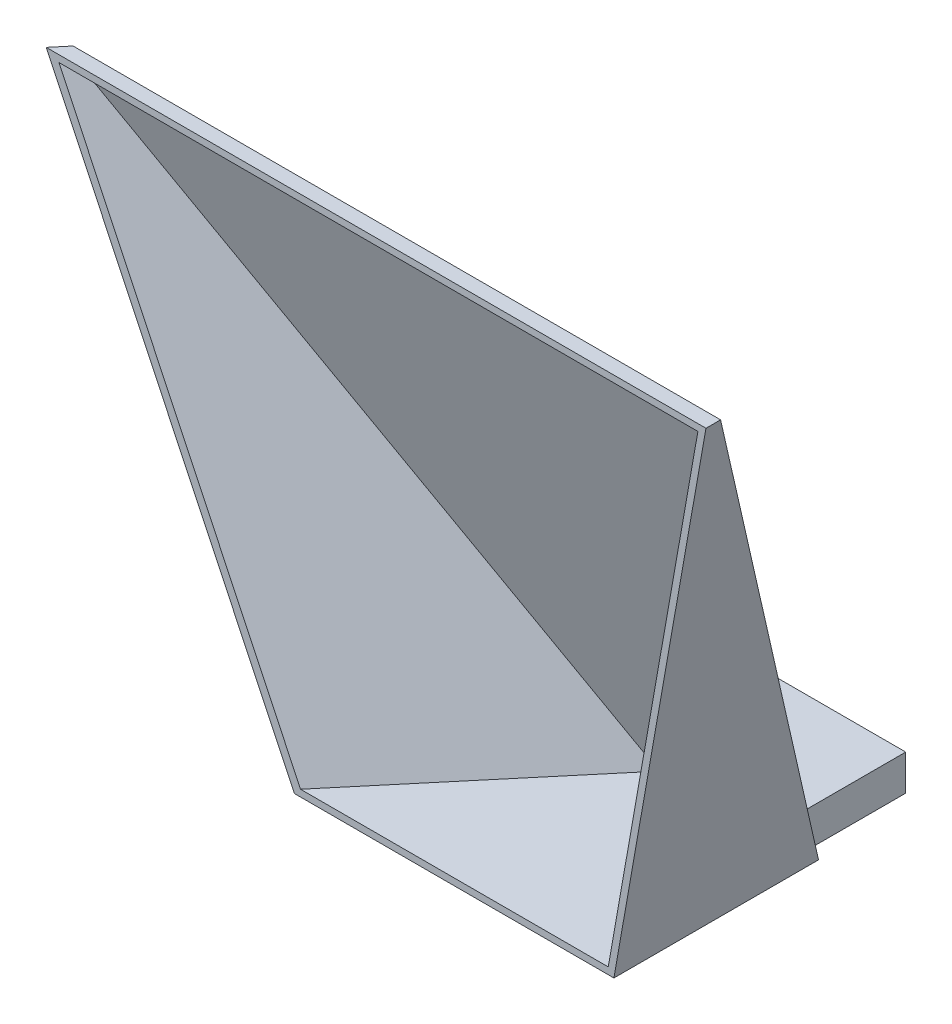
ISO-10303-21;
HEADER;
FILE_DESCRIPTION(('STEP AP214'),'2;1');
FILE_NAME('part.step','',(''),(''),'','','');
FILE_SCHEMA(('AUTOMOTIVE_DESIGN { 1 0 10303 214 1 1 1 1 }'));
ENDSEC;
DATA;
#1=APPLICATION_CONTEXT('core data for automotive mechanical design processes');
#2=APPLICATION_PROTOCOL_DEFINITION('international standard','automotive_design',2000,#1);
#3=PRODUCT_CONTEXT('',#1,'mechanical');
#4=PRODUCT('Part','Part','',(#3));
#5=PRODUCT_RELATED_PRODUCT_CATEGORY('part','',(#4));
#6=PRODUCT_DEFINITION_FORMATION('','',#4);
#7=PRODUCT_DEFINITION_CONTEXT('part definition',#1,'design');
#8=PRODUCT_DEFINITION('design','',#6,#7);
#9=PRODUCT_DEFINITION_SHAPE('','',#8);
#10=(LENGTH_UNIT() NAMED_UNIT(*) SI_UNIT(.MILLI.,.METRE.));
#11=(NAMED_UNIT(*) PLANE_ANGLE_UNIT() SI_UNIT($,.RADIAN.));
#12=(NAMED_UNIT(*) SI_UNIT($,.STERADIAN.) SOLID_ANGLE_UNIT());
#13=UNCERTAINTY_MEASURE_WITH_UNIT(LENGTH_MEASURE(1.E-05),#10,'distance_accuracy_value','');
#14=(GEOMETRIC_REPRESENTATION_CONTEXT(3) GLOBAL_UNCERTAINTY_ASSIGNED_CONTEXT((#13)) GLOBAL_UNIT_ASSIGNED_CONTEXT((#10,
#11,#12)) REPRESENTATION_CONTEXT('',''));
#15=CARTESIAN_POINT('',(0.,0.,0.));
#16=DIRECTION('',(0.,0.,1.));
#17=DIRECTION('',(1.,0.,0.));
#18=AXIS2_PLACEMENT_3D('',#15,#16,#17);
#19=CARTESIAN_POINT('',(-41.,3.49999999999999,219.382140559722));
#20=DIRECTION('',(-1.,0.,0.));
#21=DIRECTION('',(0.,1.,0.));
#22=AXIS2_PLACEMENT_3D('',#19,#20,#21);
#23=PLANE('',#22);
#24=DIRECTION('',(0.,-0.939692620785908,-0.34202014332567));
#25=VECTOR('',#24,1.);
#26=CARTESIAN_POINT('',(-41.,20.5000000000001,7.46138980245723));
#27=LINE('',#26,#25);
#28=CARTESIAN_POINT('',(-41.,20.5,7.46138980245722));
#29=VERTEX_POINT('',#28);
#30=CARTESIAN_POINT('',(-41.,3.50000000000004,1.27389581993178));
#31=VERTEX_POINT('',#30);
#32=EDGE_CURVE('E10',#29,#31,#27,.T.);
#33=ORIENTED_EDGE('',*,*,#32,.T.);
#34=DIRECTION('',(0.,0.,-1.));
#35=VECTOR('',#34,1.);
#36=CARTESIAN_POINT('',(-41.,3.49999999999999,1.27389581993177));
#37=LINE('',#36,#35);
#38=CARTESIAN_POINT('',(-41.,3.49999999999997,-60.));
#39=VERTEX_POINT('',#38);
#40=EDGE_CURVE('E255',#31,#39,#37,.T.);
#41=ORIENTED_EDGE('',*,*,#40,.T.);
#42=DIRECTION('',(0.,-1.,0.));
#43=VECTOR('',#42,1.);
#44=CARTESIAN_POINT('',(-41.,20.4999999999999,-60.));
#45=LINE('',#44,#43);
#46=CARTESIAN_POINT('',(-41.,20.4999999999999,-60.));
#47=VERTEX_POINT('',#46);
#48=EDGE_CURVE('E248',#47,#39,#45,.T.);
#49=ORIENTED_EDGE('',*,*,#48,.F.);
#50=DIRECTION('',(0.,0.,-1.));
#51=VECTOR('',#50,1.);
#52=CARTESIAN_POINT('',(-41.,20.5,7.46138980245721));
#53=LINE('',#52,#51);
#54=EDGE_CURVE('E251',#29,#47,#53,.T.);
#55=ORIENTED_EDGE('',*,*,#54,.F.);
#56=EDGE_LOOP('',(#33,#41,#49,#55));
#57=FACE_BOUND('',#56,.T.);
#58=ADVANCED_FACE('F16',(#57),#23,.F.);
#59=CARTESIAN_POINT('',(-41.,20.5,219.382140559722));
#60=DIRECTION('',(0.,1.,0.));
#61=DIRECTION('',(1.,0.,0.));
#62=AXIS2_PLACEMENT_3D('',#59,#60,#61);
#63=PLANE('',#62);
#64=DIRECTION('',(-1.,0.,0.));
#65=VECTOR('',#64,1.);
#66=CARTESIAN_POINT('',(41.,20.5,7.46138980245722));
#67=LINE('',#66,#65);
#68=CARTESIAN_POINT('',(41.,20.5,7.46138980245721));
#69=VERTEX_POINT('',#68);
#70=EDGE_CURVE('E23',#69,#29,#67,.T.);
#71=ORIENTED_EDGE('',*,*,#70,.T.);
#72=ORIENTED_EDGE('',*,*,#54,.T.);
#73=DIRECTION('',(-1.,0.,0.));
#74=VECTOR('',#73,1.);
#75=CARTESIAN_POINT('',(41.,20.5,-60.));
#76=LINE('',#75,#74);
#77=CARTESIAN_POINT('',(41.,20.5,-60.));
#78=VERTEX_POINT('',#77);
#79=EDGE_CURVE('E241',#78,#47,#76,.T.);
#80=ORIENTED_EDGE('',*,*,#79,.F.);
#81=DIRECTION('',(0.,0.,-1.));
#82=VECTOR('',#81,1.);
#83=CARTESIAN_POINT('',(41.,20.5,7.46138980245721));
#84=LINE('',#83,#82);
#85=EDGE_CURVE('E244',#69,#78,#84,.T.);
#86=ORIENTED_EDGE('',*,*,#85,.F.);
#87=EDGE_LOOP('',(#71,#72,#80,#86));
#88=FACE_BOUND('',#87,.T.);
#89=ADVANCED_FACE('F266',(#88),#63,.F.);
#90=CARTESIAN_POINT('',(41.,20.5,219.382140559722));
#91=DIRECTION('',(1.,0.,0.));
#92=DIRECTION('',(0.,-1.,0.));
#93=AXIS2_PLACEMENT_3D('',#90,#91,#92);
#94=PLANE('',#93);
#95=DIRECTION('',(0.,0.939692620785908,0.34202014332567));
#96=VECTOR('',#95,1.);
#97=CARTESIAN_POINT('',(41.,3.50000000000005,1.27389581993175));
#98=LINE('',#97,#96);
#99=CARTESIAN_POINT('',(41.,3.50000000000003,1.27389581993173));
#100=VERTEX_POINT('',#99);
#101=EDGE_CURVE('E253',#100,#69,#98,.T.);
#102=ORIENTED_EDGE('',*,*,#101,.T.);
#103=ORIENTED_EDGE('',*,*,#85,.T.);
#104=DIRECTION('',(0.,1.,0.));
#105=VECTOR('',#104,1.);
#106=CARTESIAN_POINT('',(41.,3.49999999999994,-60.));
#107=LINE('',#106,#105);
#108=CARTESIAN_POINT('',(41.,3.49999999999994,-60.));
#109=VERTEX_POINT('',#108);
#110=EDGE_CURVE('E233',#109,#78,#107,.T.);
#111=ORIENTED_EDGE('',*,*,#110,.F.);
#112=DIRECTION('',(0.,0.,-1.));
#113=VECTOR('',#112,1.);
#114=CARTESIAN_POINT('',(41.,3.50000000000001,1.27389581993171));
#115=LINE('',#114,#113);
#116=EDGE_CURVE('E236',#100,#109,#115,.T.);
#117=ORIENTED_EDGE('',*,*,#116,.F.);
#118=EDGE_LOOP('',(#102,#103,#111,#117));
#119=FACE_BOUND('',#118,.T.);
#120=ADVANCED_FACE('F271',(#119),#94,.F.);
#121=CARTESIAN_POINT('',(41.,3.50000000000001,219.382140559722));
#122=DIRECTION('',(0.,-1.,0.));
#123=DIRECTION('',(-1.,0.,0.));
#124=AXIS2_PLACEMENT_3D('',#121,#122,#123);
#125=PLANE('',#124);
#126=DIRECTION('',(1.,0.,0.));
#127=VECTOR('',#126,1.);
#128=CARTESIAN_POINT('',(-41.,3.50000000000005,1.27389581993176));
#129=LINE('',#128,#127);
#130=EDGE_CURVE('E246',#31,#100,#129,.T.);
#131=ORIENTED_EDGE('',*,*,#130,.T.);
#132=ORIENTED_EDGE('',*,*,#116,.T.);
#133=DIRECTION('',(1.,0.,0.));
#134=VECTOR('',#133,1.);
#135=CARTESIAN_POINT('',(-41.,3.49999999999999,-60.));
#136=LINE('',#135,#134);
#137=EDGE_CURVE('E222',#39,#109,#136,.T.);
#138=ORIENTED_EDGE('',*,*,#137,.F.);
#139=ORIENTED_EDGE('',*,*,#40,.F.);
#140=EDGE_LOOP('',(#131,#132,#138,#139));
#141=FACE_BOUND('',#140,.T.);
#142=ADVANCED_FACE('F260',(#141),#125,.F.);
#143=CARTESIAN_POINT('',(-138.996457585162,301.368080573303,105.432299796717));
#144=DIRECTION('',(0.,-0.34202014332567,0.939692620785908));
#145=DIRECTION('',(0.,-0.939692620785908,-0.34202014332567));
#146=AXIS2_PLACEMENT_3D('',#143,#144,#145);
#147=PLANE('',#146);
#148=DIRECTION('',(-1.,0.,0.));
#149=VECTOR('',#148,1.);
#150=CARTESIAN_POINT('',(100.165108582928,304.,106.390240127022));
#151=LINE('',#150,#149);
#152=CARTESIAN_POINT('',(100.165108582928,304.,106.390240127022));
#153=VERTEX_POINT('',#152);
#154=CARTESIAN_POINT('',(-281.768089597403,304.,106.390240127022));
#155=VERTEX_POINT('',#154);
#156=EDGE_CURVE('E238',#153,#155,#151,.T.);
#157=ORIENTED_EDGE('',*,*,#156,.F.);
#158=DIRECTION('',(0.163464460888888,0.927053025192544,0.337419706756523));
#159=VECTOR('',#158,1.);
#160=CARTESIAN_POINT('',(45.8563985247085,-4.,-5.71259202696845));
#161=LINE('',#160,#159);
#162=CARTESIAN_POINT('',(45.8563985247085,-4.,-5.71259202696845));
#163=VERTEX_POINT('',#162);
#164=EDGE_CURVE('E227',#163,#153,#161,.T.);
#165=ORIENTED_EDGE('',*,*,#164,.F.);
#166=DIRECTION('',(1.,0.,0.));
#167=VECTOR('',#166,1.);
#168=CARTESIAN_POINT('',(-41.3627902348096,-4.,-5.71259202696842));
#169=LINE('',#168,#167);
#170=CARTESIAN_POINT('',(-41.3627902348096,-4.,-5.71259202696842));
#171=VERTEX_POINT('',#170);
#172=EDGE_CURVE('E214',#171,#163,#169,.T.);
#173=ORIENTED_EDGE('',*,*,#172,.F.);
#174=DIRECTION('',(0.591432474210392,-0.75772540181011,-0.275789492006279));
#175=VECTOR('',#174,1.);
#176=CARTESIAN_POINT('',(-281.768089597403,304.,106.390240127022));
#177=LINE('',#176,#175);
#178=EDGE_CURVE('E203',#155,#171,#177,.T.);
#179=ORIENTED_EDGE('',*,*,#178,.F.);
#180=EDGE_LOOP('',(#157,#165,#173,#179));
#181=FACE_BOUND('',#180,.T.);
#182=DIRECTION('',(0.,-0.939692620785908,-0.34202014332567));
#183=VECTOR('',#182,1.);
#184=CARTESIAN_POINT('',(-43.,22.5000000000001,3.93261918108598));
#185=LINE('',#184,#183);
#186=CARTESIAN_POINT('',(-43.,22.5,3.93261918108599));
#187=VERTEX_POINT('',#186);
#188=CARTESIAN_POINT('',(-43.,1.50000000000002,-3.71075573850429));
#189=VERTEX_POINT('',#188);
#190=EDGE_CURVE('E225',#187,#189,#185,.T.);
#191=ORIENTED_EDGE('',*,*,#190,.T.);
#192=DIRECTION('',(1.,0.,0.));
#193=VECTOR('',#192,1.);
#194=CARTESIAN_POINT('',(-43.,1.50000000000011,-3.71075573850428));
#195=LINE('',#194,#193);
#196=CARTESIAN_POINT('',(43.,1.50000000000002,-3.71075573850432));
#197=VERTEX_POINT('',#196);
#198=EDGE_CURVE('E211',#189,#197,#195,.T.);
#199=ORIENTED_EDGE('',*,*,#198,.T.);
#200=DIRECTION('',(0.,0.939692620785908,0.34202014332567));
#201=VECTOR('',#200,1.);
#202=CARTESIAN_POINT('',(43.,1.50000000000005,-3.71075573850431));
#203=LINE('',#202,#201);
#204=CARTESIAN_POINT('',(43.,22.5,3.93261918108597));
#205=VERTEX_POINT('',#204);
#206=EDGE_CURVE('E219',#197,#205,#203,.T.);
#207=ORIENTED_EDGE('',*,*,#206,.T.);
#208=DIRECTION('',(-1.,0.,0.));
#209=VECTOR('',#208,1.);
#210=CARTESIAN_POINT('',(43.,22.5,3.93261918108597));
#211=LINE('',#210,#209);
#212=EDGE_CURVE('E230',#205,#187,#211,.T.);
#213=ORIENTED_EDGE('',*,*,#212,.T.);
#214=EDGE_LOOP('',(#191,#199,#207,#213));
#215=FACE_BOUND('',#214,.T.);
#216=ADVANCED_FACE('F279',(#181,#215),#147,.F.);
#217=CARTESIAN_POINT('',(-43.,22.5,215.965390219904));
#218=DIRECTION('',(0.,1.,0.));
#219=DIRECTION('',(1.,0.,0.));
#220=AXIS2_PLACEMENT_3D('',#217,#218,#219);
#221=PLANE('',#220);
#222=ORIENTED_EDGE('',*,*,#212,.F.);
#223=DIRECTION('',(0.,0.,-1.));
#224=VECTOR('',#223,1.);
#225=CARTESIAN_POINT('',(43.,22.5,3.93261918108598));
#226=LINE('',#225,#224);
#227=CARTESIAN_POINT('',(43.,22.5,-60.));
#228=VERTEX_POINT('',#227);
#229=EDGE_CURVE('E217',#205,#228,#226,.T.);
#230=ORIENTED_EDGE('',*,*,#229,.T.);
#231=DIRECTION('',(1.,0.,0.));
#232=VECTOR('',#231,1.);
#233=CARTESIAN_POINT('',(-43.,22.5,-60.));
#234=LINE('',#233,#232);
#235=CARTESIAN_POINT('',(-43.,22.5,-60.));
#236=VERTEX_POINT('',#235);
#237=EDGE_CURVE('E206',#236,#228,#234,.T.);
#238=ORIENTED_EDGE('',*,*,#237,.F.);
#239=DIRECTION('',(0.,0.,-1.));
#240=VECTOR('',#239,1.);
#241=CARTESIAN_POINT('',(-43.,22.5,3.93261918108601));
#242=LINE('',#241,#240);
#243=EDGE_CURVE('E195',#187,#236,#242,.T.);
#244=ORIENTED_EDGE('',*,*,#243,.F.);
#245=EDGE_LOOP('',(#222,#230,#238,#244));
#246=FACE_BOUND('',#245,.T.);
#247=ADVANCED_FACE('F319',(#246),#221,.T.);
#248=CARTESIAN_POINT('',(43.,22.5,215.965390219904));
#249=DIRECTION('',(1.,0.,0.));
#250=DIRECTION('',(0.,-1.,0.));
#251=AXIS2_PLACEMENT_3D('',#248,#249,#250);
#252=PLANE('',#251);
#253=ORIENTED_EDGE('',*,*,#206,.F.);
#254=DIRECTION('',(0.,0.,-1.));
#255=VECTOR('',#254,1.);
#256=CARTESIAN_POINT('',(43.,1.49999999999997,-3.71075573850436));
#257=LINE('',#256,#255);
#258=CARTESIAN_POINT('',(43.,1.49999999999997,-60.));
#259=VERTEX_POINT('',#258);
#260=EDGE_CURVE('E209',#197,#259,#257,.T.);
#261=ORIENTED_EDGE('',*,*,#260,.T.);
#262=DIRECTION('',(0.,-1.,0.));
#263=VECTOR('',#262,1.);
#264=CARTESIAN_POINT('',(43.,22.5,-60.));
#265=LINE('',#264,#263);
#266=EDGE_CURVE('E198',#228,#259,#265,.T.);
#267=ORIENTED_EDGE('',*,*,#266,.F.);
#268=ORIENTED_EDGE('',*,*,#229,.F.);
#269=EDGE_LOOP('',(#253,#261,#267,#268));
#270=FACE_BOUND('',#269,.T.);
#271=ADVANCED_FACE('F330',(#270),#252,.T.);
#272=CARTESIAN_POINT('',(43.,1.49999999999997,215.965390219904));
#273=DIRECTION('',(0.,-1.,0.));
#274=DIRECTION('',(-1.,0.,0.));
#275=AXIS2_PLACEMENT_3D('',#272,#273,#274);
#276=PLANE('',#275);
#277=ORIENTED_EDGE('',*,*,#198,.F.);
#278=DIRECTION('',(0.,0.,-1.));
#279=VECTOR('',#278,1.);
#280=CARTESIAN_POINT('',(-43.,1.49999999999997,-3.7107557385043));
#281=LINE('',#280,#279);
#282=CARTESIAN_POINT('',(-43.,1.49999999999997,-60.));
#283=VERTEX_POINT('',#282);
#284=EDGE_CURVE('E201',#189,#283,#281,.T.);
#285=ORIENTED_EDGE('',*,*,#284,.T.);
#286=DIRECTION('',(-1.,0.,0.));
#287=VECTOR('',#286,1.);
#288=CARTESIAN_POINT('',(43.,1.49999999999997,-60.));
#289=LINE('',#288,#287);
#290=EDGE_CURVE('E190',#259,#283,#289,.T.);
#291=ORIENTED_EDGE('',*,*,#290,.F.);
#292=ORIENTED_EDGE('',*,*,#260,.F.);
#293=EDGE_LOOP('',(#277,#285,#291,#292));
#294=FACE_BOUND('',#293,.T.);
#295=ADVANCED_FACE('F341',(#294),#276,.T.);
#296=CARTESIAN_POINT('',(-43.,1.49999999999997,215.965390219904));
#297=DIRECTION('',(-1.,0.,0.));
#298=DIRECTION('',(0.,1.,0.));
#299=AXIS2_PLACEMENT_3D('',#296,#297,#298);
#300=PLANE('',#299);
#301=ORIENTED_EDGE('',*,*,#190,.F.);
#302=ORIENTED_EDGE('',*,*,#243,.T.);
#303=DIRECTION('',(0.,1.,0.));
#304=VECTOR('',#303,1.);
#305=CARTESIAN_POINT('',(-43.,1.49999999999997,-60.));
#306=LINE('',#305,#304);
#307=EDGE_CURVE('E185',#283,#236,#306,.T.);
#308=ORIENTED_EDGE('',*,*,#307,.F.);
#309=ORIENTED_EDGE('',*,*,#284,.F.);
#310=EDGE_LOOP('',(#301,#302,#308,#309));
#311=FACE_BOUND('',#310,.T.);
#312=ADVANCED_FACE('F352',(#311),#300,.T.);
#313=CARTESIAN_POINT('',(-138.996457585162,300.,109.191070279861));
#314=DIRECTION('',(0.,-0.34202014332567,0.939692620785908));
#315=DIRECTION('',(0.,-0.939692620785908,-0.34202014332567));
#316=AXIS2_PLACEMENT_3D('',#313,#314,#315);
#317=PLANE('',#316);
#318=DIRECTION('',(0.591432474210392,-0.75772540181011,-0.275789492006279));
#319=VECTOR('',#318,1.);
#320=CARTESIAN_POINT('',(-276.661005872656,300.,109.191070279861));
#321=LINE('',#320,#319);
#322=CARTESIAN_POINT('',(-276.661005872656,300.,109.191070279861));
#323=VERTEX_POINT('',#322);
#324=CARTESIAN_POINT('',(-42.5,0.,0.));
#325=VERTEX_POINT('',#324);
#326=EDGE_CURVE('E193',#323,#325,#321,.T.);
#327=ORIENTED_EDGE('',*,*,#326,.T.);
#328=DIRECTION('',(1.,0.,0.));
#329=VECTOR('',#328,1.);
#330=CARTESIAN_POINT('',(-42.5,0.,0.));
#331=LINE('',#330,#329);
#332=CARTESIAN_POINT('',(42.5,0.,0.));
#333=VERTEX_POINT('',#332);
#334=EDGE_CURVE('E188',#325,#333,#331,.T.);
#335=ORIENTED_EDGE('',*,*,#334,.T.);
#336=DIRECTION('',(0.163464460888888,0.927053025192544,0.337419706756523));
#337=VECTOR('',#336,1.);
#338=CARTESIAN_POINT('',(42.5,0.,0.));
#339=LINE('',#338,#337);
#340=CARTESIAN_POINT('',(95.3980942125518,300.,109.191070279861));
#341=VERTEX_POINT('',#340);
#342=EDGE_CURVE('E181',#333,#341,#339,.T.);
#343=ORIENTED_EDGE('',*,*,#342,.T.);
#344=DIRECTION('',(-1.,0.,0.));
#345=VECTOR('',#344,1.);
#346=CARTESIAN_POINT('',(95.3980942125518,300.,109.191070279861));
#347=LINE('',#346,#345);
#348=EDGE_CURVE('E133',#341,#323,#347,.T.);
#349=ORIENTED_EDGE('',*,*,#348,.T.);
#350=EDGE_LOOP('',(#327,#335,#343,#349));
#351=FACE_BOUND('',#350,.T.);
#352=ORIENTED_EDGE('',*,*,#130,.F.);
#353=ORIENTED_EDGE('',*,*,#32,.F.);
#354=ORIENTED_EDGE('',*,*,#70,.F.);
#355=ORIENTED_EDGE('',*,*,#101,.F.);
#356=EDGE_LOOP('',(#352,#353,#354,#355));
#357=FACE_BOUND('',#356,.T.);
#358=ADVANCED_FACE('F268',(#351,#357),#317,.T.);
#359=CARTESIAN_POINT('',(0.,0.,-60.));
#360=DIRECTION('',(0.,0.,-1.));
#361=DIRECTION('',(1.,0.,0.));
#362=AXIS2_PLACEMENT_3D('',#359,#360,#361);
#363=PLANE('',#362);
#364=ORIENTED_EDGE('',*,*,#237,.T.);
#365=ORIENTED_EDGE('',*,*,#266,.T.);
#366=ORIENTED_EDGE('',*,*,#290,.T.);
#367=ORIENTED_EDGE('',*,*,#307,.T.);
#368=EDGE_LOOP('',(#364,#365,#366,#367));
#369=FACE_BOUND('',#368,.T.);
#370=ORIENTED_EDGE('',*,*,#48,.T.);
#371=ORIENTED_EDGE('',*,*,#137,.T.);
#372=ORIENTED_EDGE('',*,*,#110,.T.);
#373=ORIENTED_EDGE('',*,*,#79,.T.);
#374=EDGE_LOOP('',(#370,#371,#372,#373));
#375=FACE_BOUND('',#374,.T.);
#376=ADVANCED_FACE('F264',(#369,#375),#363,.T.);
#377=CARTESIAN_POINT('',(0.,304.,0.));
#378=DIRECTION('',(0.,1.,0.));
#379=DIRECTION('',(-1.,0.,0.));
#380=AXIS2_PLACEMENT_3D('',#377,#378,#379);
#381=PLANE('',#380);
#382=DIRECTION('',(-0.642787609685662,0.,0.766044443119714));
#383=VECTOR('',#382,1.);
#384=CARTESIAN_POINT('',(-281.768089597403,304.,106.390240127022));
#385=LINE('',#384,#383);
#386=CARTESIAN_POINT('',(-288.992535931326,304.,115.));
#387=VERTEX_POINT('',#386);
#388=EDGE_CURVE('E183',#155,#387,#385,.T.);
#389=ORIENTED_EDGE('',*,*,#388,.T.);
#390=DIRECTION('',(1.,0.,0.));
#391=VECTOR('',#390,1.);
#392=CARTESIAN_POINT('',(-288.992535931326,304.,115.));
#393=LINE('',#392,#391);
#394=CARTESIAN_POINT('',(100.165108582929,304.,115.));
#395=VERTEX_POINT('',#394);
#396=EDGE_CURVE('E176',#387,#395,#393,.T.);
#397=ORIENTED_EDGE('',*,*,#396,.T.);
#398=DIRECTION('',(-1.12237522868278E-13,0.,-1.));
#399=VECTOR('',#398,1.);
#400=CARTESIAN_POINT('',(100.165108582929,304.,115.));
#401=LINE('',#400,#399);
#402=EDGE_CURVE('E169',#395,#153,#401,.T.);
#403=ORIENTED_EDGE('',*,*,#402,.T.);
#404=ORIENTED_EDGE('',*,*,#156,.T.);
#405=EDGE_LOOP('',(#389,#397,#403,#404));
#406=FACE_BOUND('',#405,.T.);
#407=ADVANCED_FACE('F382',(#406),#381,.T.);
#408=CARTESIAN_POINT('',(126.819509464419,455.164619132071,-9.4660799777143E-12));
#409=DIRECTION('',(0.984807753012208,-0.17364817766693,-1.1098611677583E-13));
#410=DIRECTION('',(1.12698256524037E-13,0.,1.));
#411=AXIS2_PLACEMENT_3D('',#408,#409,#410);
#412=PLANE('',#411);
#413=DIRECTION('',(0.17364817766693,0.984807753012208,0.));
#414=VECTOR('',#413,1.);
#415=CARTESIAN_POINT('',(45.8563985247221,-4.00000000000001,115.));
#416=LINE('',#415,#414);
#417=CARTESIAN_POINT('',(45.8563985247221,-4.00000000000001,115.));
#418=VERTEX_POINT('',#417);
#419=EDGE_CURVE('E178',#418,#395,#416,.T.);
#420=ORIENTED_EDGE('',*,*,#419,.F.);
#421=DIRECTION('',(-1.1266254608641E-13,0.,-1.));
#422=VECTOR('',#421,1.);
#423=CARTESIAN_POINT('',(45.8563985247221,-4.,115.));
#424=LINE('',#423,#422);
#425=EDGE_CURVE('E172',#418,#163,#424,.T.);
#426=ORIENTED_EDGE('',*,*,#425,.T.);
#427=ORIENTED_EDGE('',*,*,#164,.T.);
#428=ORIENTED_EDGE('',*,*,#402,.F.);
#429=EDGE_LOOP('',(#420,#426,#427,#428));
#430=FACE_BOUND('',#429,.T.);
#431=ADVANCED_FACE('F393',(#430),#412,.T.);
#432=CARTESIAN_POINT('',(0.,-4.,0.));
#433=DIRECTION('',(0.,1.,0.));
#434=DIRECTION('',(-1.,0.,0.));
#435=AXIS2_PLACEMENT_3D('',#432,#433,#434);
#436=PLANE('',#435);
#437=ORIENTED_EDGE('',*,*,#172,.T.);
#438=ORIENTED_EDGE('',*,*,#425,.F.);
#439=DIRECTION('',(1.,0.,0.));
#440=VECTOR('',#439,1.);
#441=CARTESIAN_POINT('',(-142.652681682856,-4.00000000000001,115.));
#442=LINE('',#441,#440);
#443=CARTESIAN_POINT('',(-142.652681682856,-4.00000000000001,115.));
#444=VERTEX_POINT('',#443);
#445=EDGE_CURVE('E165',#444,#418,#442,.T.);
#446=ORIENTED_EDGE('',*,*,#445,.F.);
#447=DIRECTION('',(-0.642787609685658,0.,0.766044443119718));
#448=VECTOR('',#447,1.);
#449=CARTESIAN_POINT('',(-41.3627902348096,-4.00000000000006,-5.71259202696844));
#450=LINE('',#449,#448);
#451=EDGE_CURVE('E136',#171,#444,#450,.T.);
#452=ORIENTED_EDGE('',*,*,#451,.F.);
#453=EDGE_LOOP('',(#437,#438,#446,#452));
#454=FACE_BOUND('',#453,.T.);
#455=ADVANCED_FACE('F404',(#454),#436,.F.);
#456=CARTESIAN_POINT('',(-244.658444302457,367.269639083408,26.3390659162656));
#457=DIRECTION('',(-0.719846310393649,-0.342020143325669,-0.604022773554226));
#458=DIRECTION('',(0.642787609685658,0.,-0.766044443119718));
#459=AXIS2_PLACEMENT_3D('',#456,#457,#458);
#460=PLANE('',#459);
#461=ORIENTED_EDGE('',*,*,#388,.F.);
#462=ORIENTED_EDGE('',*,*,#178,.T.);
#463=ORIENTED_EDGE('',*,*,#451,.T.);
#464=DIRECTION('',(-0.42915217206039,0.903232203376214,0.));
#465=VECTOR('',#464,1.);
#466=CARTESIAN_POINT('',(-142.652681682856,-4.00000000000006,115.));
#467=LINE('',#466,#465);
#468=EDGE_CURVE('E156',#444,#387,#467,.T.);
#469=ORIENTED_EDGE('',*,*,#468,.T.);
#470=EDGE_LOOP('',(#461,#462,#463,#469));
#471=FACE_BOUND('',#470,.T.);
#472=ADVANCED_FACE('F415',(#471),#460,.T.);
#473=CARTESIAN_POINT('',(-241.779059060883,368.63771965671,28.7551570104825));
#474=DIRECTION('',(-0.719846310393649,-0.342020143325669,-0.604022773554226));
#475=DIRECTION('',(0.642787609685658,0.,-0.766044443119718));
#476=AXIS2_PLACEMENT_3D('',#473,#474,#475);
#477=PLANE('',#476);
#478=DIRECTION('',(-0.42915217206039,0.903232203376214,0.));
#479=VECTOR('',#478,1.);
#480=CARTESIAN_POINT('',(-138.996457585162,0.,115.));
#481=LINE('',#480,#479);
#482=CARTESIAN_POINT('',(-138.996457585162,0.,115.));
#483=VERTEX_POINT('',#482);
#484=CARTESIAN_POINT('',(-281.535276658347,300.,115.));
#485=VERTEX_POINT('',#484);
#486=EDGE_CURVE('E150',#483,#485,#481,.T.);
#487=ORIENTED_EDGE('',*,*,#486,.F.);
#488=DIRECTION('',(-0.642787609685658,0.,0.766044443119717));
#489=VECTOR('',#488,1.);
#490=CARTESIAN_POINT('',(-42.5,0.,0.));
#491=LINE('',#490,#489);
#492=EDGE_CURVE('E162',#325,#483,#491,.T.);
#493=ORIENTED_EDGE('',*,*,#492,.F.);
#494=ORIENTED_EDGE('',*,*,#326,.F.);
#495=DIRECTION('',(-0.642787609685658,0.,0.766044443119718));
#496=VECTOR('',#495,1.);
#497=CARTESIAN_POINT('',(-276.661005872656,300.,109.191070279861));
#498=LINE('',#497,#496);
#499=EDGE_CURVE('E151',#323,#485,#498,.T.);
#500=ORIENTED_EDGE('',*,*,#499,.T.);
#501=EDGE_LOOP('',(#487,#493,#494,#500));
#502=FACE_BOUND('',#501,.T.);
#503=ADVANCED_FACE('F426',(#502),#477,.F.);
#504=CARTESIAN_POINT('',(0.,0.,0.));
#505=DIRECTION('',(0.,1.,0.));
#506=DIRECTION('',(-1.,0.,0.));
#507=AXIS2_PLACEMENT_3D('',#504,#505,#506);
#508=PLANE('',#507);
#509=ORIENTED_EDGE('',*,*,#492,.T.);
#510=DIRECTION('',(1.,0.,0.));
#511=VECTOR('',#510,1.);
#512=CARTESIAN_POINT('',(-138.996457585162,0.,115.));
#513=LINE('',#512,#511);
#514=CARTESIAN_POINT('',(42.500000000013,0.,115.));
#515=VERTEX_POINT('',#514);
#516=EDGE_CURVE('E137',#483,#515,#513,.T.);
#517=ORIENTED_EDGE('',*,*,#516,.T.);
#518=DIRECTION('',(-1.12698256524037E-13,0.,-1.));
#519=VECTOR('',#518,1.);
#520=CARTESIAN_POINT('',(42.500000000013,0.,115.));
#521=LINE('',#520,#519);
#522=EDGE_CURVE('E144',#515,#333,#521,.T.);
#523=ORIENTED_EDGE('',*,*,#522,.T.);
#524=ORIENTED_EDGE('',*,*,#334,.F.);
#525=EDGE_LOOP('',(#509,#517,#523,#524));
#526=FACE_BOUND('',#525,.T.);
#527=ADVANCED_FACE('F437',(#526),#508,.T.);
#528=CARTESIAN_POINT('',(122.880278452371,455.859211842738,-9.02213551061098E-12));
#529=DIRECTION('',(0.984807753012208,-0.17364817766693,-1.1098611677583E-13));
#530=DIRECTION('',(1.12698256524037E-13,0.,1.));
#531=AXIS2_PLACEMENT_3D('',#528,#529,#530);
#532=PLANE('',#531);
#533=DIRECTION('',(-1.12533521387422E-13,0.,-1.));
#534=VECTOR('',#533,1.);
#535=CARTESIAN_POINT('',(95.3980942125524,300.,115.));
#536=LINE('',#535,#534);
#537=CARTESIAN_POINT('',(95.3980942125524,300.,115.));
#538=VERTEX_POINT('',#537);
#539=EDGE_CURVE('E127',#538,#341,#536,.T.);
#540=ORIENTED_EDGE('',*,*,#539,.T.);
#541=ORIENTED_EDGE('',*,*,#342,.F.);
#542=ORIENTED_EDGE('',*,*,#522,.F.);
#543=DIRECTION('',(0.17364817766693,0.984807753012208,0.));
#544=VECTOR('',#543,1.);
#545=CARTESIAN_POINT('',(42.500000000013,0.,115.));
#546=LINE('',#545,#544);
#547=EDGE_CURVE('E141',#515,#538,#546,.T.);
#548=ORIENTED_EDGE('',*,*,#547,.T.);
#549=EDGE_LOOP('',(#540,#541,#542,#548));
#550=FACE_BOUND('',#549,.T.);
#551=ADVANCED_FACE('F142',(#550),#532,.F.);
#552=CARTESIAN_POINT('',(0.,300.,0.));
#553=DIRECTION('',(0.,1.,0.));
#554=DIRECTION('',(-1.,0.,0.));
#555=AXIS2_PLACEMENT_3D('',#552,#553,#554);
#556=PLANE('',#555);
#557=ORIENTED_EDGE('',*,*,#348,.F.);
#558=ORIENTED_EDGE('',*,*,#539,.F.);
#559=DIRECTION('',(1.,0.,0.));
#560=VECTOR('',#559,1.);
#561=CARTESIAN_POINT('',(-281.535276658347,300.,115.));
#562=LINE('',#561,#560);
#563=EDGE_CURVE('E132',#485,#538,#562,.T.);
#564=ORIENTED_EDGE('',*,*,#563,.F.);
#565=ORIENTED_EDGE('',*,*,#499,.F.);
#566=EDGE_LOOP('',(#557,#558,#564,#565));
#567=FACE_BOUND('',#566,.T.);
#568=ADVANCED_FACE('F129',(#567),#556,.F.);
#569=CARTESIAN_POINT('',(-138.996457585162,0.,115.));
#570=DIRECTION('',(0.,0.,1.));
#571=DIRECTION('',(1.,0.,0.));
#572=AXIS2_PLACEMENT_3D('',#569,#570,#571);
#573=PLANE('',#572);
#574=ORIENTED_EDGE('',*,*,#445,.T.);
#575=ORIENTED_EDGE('',*,*,#419,.T.);
#576=ORIENTED_EDGE('',*,*,#396,.F.);
#577=ORIENTED_EDGE('',*,*,#468,.F.);
#578=EDGE_LOOP('',(#574,#575,#576,#577));
#579=FACE_BOUND('',#578,.T.);
#580=ORIENTED_EDGE('',*,*,#486,.T.);
#581=ORIENTED_EDGE('',*,*,#563,.T.);
#582=ORIENTED_EDGE('',*,*,#547,.F.);
#583=ORIENTED_EDGE('',*,*,#516,.F.);
#584=EDGE_LOOP('',(#580,#581,#582,#583));
#585=FACE_BOUND('',#584,.T.);
#586=ADVANCED_FACE('F149',(#579,#585),#573,.T.);
#587=CLOSED_SHELL('',(#58,#89,#120,#142,#216,#247,#271,#295,#312,#358,#376,#407,#431,#455,#472,
#503,#527,#551,#568,#586));
#588=MANIFOLD_SOLID_BREP('B1',#587);
#589=ADVANCED_BREP_SHAPE_REPRESENTATION('',(#18,#588),#14);
#590=SHAPE_DEFINITION_REPRESENTATION(#9,#589);
ENDSEC;
END-ISO-10303-21;
